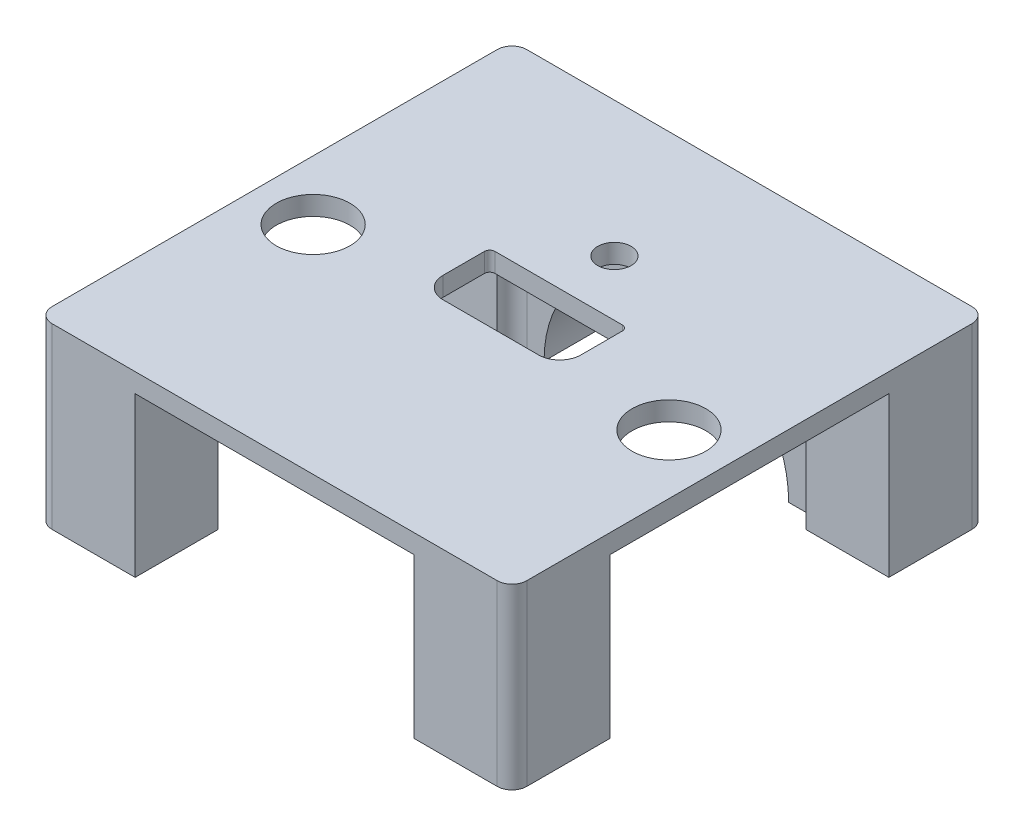
ISO-10303-21;
HEADER;
FILE_DESCRIPTION(('STEP AP214'),'2;1');
FILE_NAME('part.step','',(''),(''),'','','');
FILE_SCHEMA(('AUTOMOTIVE_DESIGN { 1 0 10303 214 1 1 1 1 }'));
ENDSEC;
DATA;
#1=APPLICATION_CONTEXT('core data for automotive mechanical design processes');
#2=APPLICATION_PROTOCOL_DEFINITION('international standard','automotive_design',2000,#1);
#3=PRODUCT_CONTEXT('',#1,'mechanical');
#4=PRODUCT('Part','Part','',(#3));
#5=PRODUCT_RELATED_PRODUCT_CATEGORY('part','',(#4));
#6=PRODUCT_DEFINITION_FORMATION('','',#4);
#7=PRODUCT_DEFINITION_CONTEXT('part definition',#1,'design');
#8=PRODUCT_DEFINITION('design','',#6,#7);
#9=PRODUCT_DEFINITION_SHAPE('','',#8);
#10=(LENGTH_UNIT() NAMED_UNIT(*) SI_UNIT(.MILLI.,.METRE.));
#11=(NAMED_UNIT(*) PLANE_ANGLE_UNIT() SI_UNIT($,.RADIAN.));
#12=(NAMED_UNIT(*) SI_UNIT($,.STERADIAN.) SOLID_ANGLE_UNIT());
#13=UNCERTAINTY_MEASURE_WITH_UNIT(LENGTH_MEASURE(1.E-05),#10,'distance_accuracy_value','');
#14=(GEOMETRIC_REPRESENTATION_CONTEXT(3) GLOBAL_UNCERTAINTY_ASSIGNED_CONTEXT((#13)) GLOBAL_UNIT_ASSIGNED_CONTEXT((#10,
#11,#12)) REPRESENTATION_CONTEXT('',''));
#15=CARTESIAN_POINT('',(0.,0.,0.));
#16=DIRECTION('',(0.,0.,1.));
#17=DIRECTION('',(1.,0.,0.));
#18=AXIS2_PLACEMENT_3D('',#15,#16,#17);
#19=CARTESIAN_POINT('',(20.975,-15.,-20.975));
#20=DIRECTION('',(0.,-1.,0.));
#21=DIRECTION('',(0.,0.,-1.));
#22=AXIS2_PLACEMENT_3D('',#19,#20,#21);
#23=PLANE('',#22);
#24=DIRECTION('',(0.,0.,-1.));
#25=VECTOR('',#24,1.);
#26=CARTESIAN_POINT('',(-11.530245674906,-15.,22.376));
#27=LINE('',#26,#25);
#28=CARTESIAN_POINT('',(-11.530245674906,-15.,-22.375));
#29=VERTEX_POINT('',#28);
#30=CARTESIAN_POINT('',(-11.530245674906,-15.,-14.55));
#31=VERTEX_POINT('',#30);
#32=EDGE_CURVE('E259',#29,#31,#27,.F.);
#33=ORIENTED_EDGE('',*,*,#32,.T.);
#34=DIRECTION('',(-1.,0.,0.));
#35=VECTOR('',#34,1.);
#36=CARTESIAN_POINT('',(-13.15,-15.,-14.55));
#37=LINE('',#36,#35);
#38=CARTESIAN_POINT('',(-13.15,-15.,-14.55));
#39=VERTEX_POINT('',#38);
#40=EDGE_CURVE('E269',#31,#39,#37,.T.);
#41=ORIENTED_EDGE('',*,*,#40,.T.);
#42=CARTESIAN_POINT('',(-13.15,-15.,-13.15));
#43=DIRECTION('',(0.,1.,0.));
#44=DIRECTION('',(0.,0.,1.));
#45=AXIS2_PLACEMENT_3D('',#42,#43,#44);
#46=CIRCLE('',#45,1.4);
#47=CARTESIAN_POINT('',(-14.55,-15.,-13.15));
#48=VERTEX_POINT('',#47);
#49=EDGE_CURVE('E278',#39,#48,#46,.T.);
#50=ORIENTED_EDGE('',*,*,#49,.T.);
#51=DIRECTION('',(-1.,0.,0.));
#52=VECTOR('',#51,1.);
#53=CARTESIAN_POINT('',(-14.55,-15.,-13.15));
#54=LINE('',#53,#52);
#55=CARTESIAN_POINT('',(-22.375,-15.,-13.15));
#56=VERTEX_POINT('',#55);
#57=EDGE_CURVE('E282',#48,#56,#54,.T.);
#58=ORIENTED_EDGE('',*,*,#57,.T.);
#59=DIRECTION('',(0.,0.,-1.));
#60=VECTOR('',#59,1.);
#61=CARTESIAN_POINT('',(-22.375,-15.,-20.975));
#62=LINE('',#61,#60);
#63=CARTESIAN_POINT('',(-22.375,-15.,-20.975));
#64=VERTEX_POINT('',#63);
#65=EDGE_CURVE('E289',#56,#64,#62,.T.);
#66=ORIENTED_EDGE('',*,*,#65,.T.);
#67=CARTESIAN_POINT('',(-20.975,-15.,-20.975));
#68=DIRECTION('',(0.,-1.,0.));
#69=DIRECTION('',(0.,0.,1.));
#70=AXIS2_PLACEMENT_3D('',#67,#68,#69);
#71=CIRCLE('',#70,1.4);
#72=CARTESIAN_POINT('',(-20.975,-15.,-22.375));
#73=VERTEX_POINT('',#72);
#74=EDGE_CURVE('E293',#64,#73,#71,.T.);
#75=ORIENTED_EDGE('',*,*,#74,.T.);
#76=DIRECTION('',(1.,0.,0.));
#77=VECTOR('',#76,1.);
#78=CARTESIAN_POINT('',(-20.975,-15.,-22.375));
#79=LINE('',#78,#77);
#80=EDGE_CURVE('E298',#73,#29,#79,.T.);
#81=ORIENTED_EDGE('',*,*,#80,.T.);
#82=EDGE_LOOP('',(#33,#41,#50,#58,#66,#75,#81));
#83=FACE_BOUND('',#82,.T.);
#84=ADVANCED_FACE('F43',(#83),#23,.T.);
#85=CARTESIAN_POINT('',(-20.975,0.,20.975));
#86=DIRECTION('',(0.,1.,0.));
#87=DIRECTION('',(0.,0.,1.));
#88=AXIS2_PLACEMENT_3D('',#85,#86,#87);
#89=PLANE('',#88);
#90=CARTESIAN_POINT('',(-16.77,0.,1.975));
#91=DIRECTION('',(0.,1.,0.));
#92=DIRECTION('',(0.,0.,1.));
#93=AXIS2_PLACEMENT_3D('',#90,#91,#92);
#94=CIRCLE('',#93,3.475);
#95=CARTESIAN_POINT('',(-16.77,0.,5.45));
#96=VERTEX_POINT('',#95);
#97=EDGE_CURVE('E260',#96,#96,#94,.T.);
#98=ORIENTED_EDGE('',*,*,#97,.T.);
#99=EDGE_LOOP('',(#98));
#100=FACE_BOUND('',#99,.T.);
#101=CARTESIAN_POINT('',(16.77,0.,1.97499999999999));
#102=DIRECTION('',(0.,1.,0.));
#103=DIRECTION('',(0.,0.,1.));
#104=AXIS2_PLACEMENT_3D('',#101,#102,#103);
#105=CIRCLE('',#104,3.475);
#106=CARTESIAN_POINT('',(16.77,0.,5.44999999999999));
#107=VERTEX_POINT('',#106);
#108=EDGE_CURVE('E739',#107,#107,#105,.T.);
#109=ORIENTED_EDGE('',*,*,#108,.T.);
#110=EDGE_LOOP('',(#109));
#111=FACE_BOUND('',#110,.T.);
#112=CARTESIAN_POINT('',(0.,0.,-9.65499999999999));
#113=DIRECTION('',(0.,1.,0.));
#114=DIRECTION('',(0.,0.,1.));
#115=AXIS2_PLACEMENT_3D('',#112,#113,#114);
#116=CIRCLE('',#115,1.575);
#117=CARTESIAN_POINT('',(0.,0.,-8.07999999999999));
#118=VERTEX_POINT('',#117);
#119=EDGE_CURVE('E347',#118,#118,#116,.T.);
#120=ORIENTED_EDGE('',*,*,#119,.T.);
#121=EDGE_LOOP('',(#120));
#122=FACE_BOUND('',#121,.T.);
#123=CARTESIAN_POINT('',(-4.5,0.,0.));
#124=DIRECTION('',(0.,1.,0.));
#125=DIRECTION('',(0.,0.,1.));
#126=AXIS2_PLACEMENT_3D('',#123,#124,#125);
#127=CIRCLE('',#126,2.);
#128=CARTESIAN_POINT('',(-6.5,0.,0.));
#129=VERTEX_POINT('',#128);
#130=CARTESIAN_POINT('',(-4.5,0.,2.));
#131=VERTEX_POINT('',#130);
#132=EDGE_CURVE('E352',#129,#131,#127,.T.);
#133=ORIENTED_EDGE('',*,*,#132,.T.);
#134=DIRECTION('',(1.,0.,0.));
#135=VECTOR('',#134,1.);
#136=CARTESIAN_POINT('',(-4.5,0.,2.));
#137=LINE('',#136,#135);
#138=CARTESIAN_POINT('',(4.5,0.,2.));
#139=VERTEX_POINT('',#138);
#140=EDGE_CURVE('E386',#131,#139,#137,.T.);
#141=ORIENTED_EDGE('',*,*,#140,.T.);
#142=CARTESIAN_POINT('',(4.5,0.,0.));
#143=DIRECTION('',(0.,1.,0.));
#144=DIRECTION('',(0.,0.,-1.));
#145=AXIS2_PLACEMENT_3D('',#142,#143,#144);
#146=CIRCLE('',#145,2.);
#147=CARTESIAN_POINT('',(6.5,0.,0.));
#148=VERTEX_POINT('',#147);
#149=EDGE_CURVE('E390',#139,#148,#146,.T.);
#150=ORIENTED_EDGE('',*,*,#149,.T.);
#151=DIRECTION('',(0.,0.,-1.));
#152=VECTOR('',#151,1.);
#153=CARTESIAN_POINT('',(6.5,0.,0.));
#154=LINE('',#153,#152);
#155=CARTESIAN_POINT('',(6.5,0.,-3.9));
#156=VERTEX_POINT('',#155);
#157=EDGE_CURVE('E394',#148,#156,#154,.T.);
#158=ORIENTED_EDGE('',*,*,#157,.T.);
#159=CARTESIAN_POINT('',(6.,0.,-3.9));
#160=DIRECTION('',(0.,1.,0.));
#161=DIRECTION('',(0.,0.,1.));
#162=AXIS2_PLACEMENT_3D('',#159,#160,#161);
#163=CIRCLE('',#162,0.499999999999999);
#164=CARTESIAN_POINT('',(6.,0.,-4.4));
#165=VERTEX_POINT('',#164);
#166=EDGE_CURVE('E398',#156,#165,#163,.T.);
#167=ORIENTED_EDGE('',*,*,#166,.T.);
#168=DIRECTION('',(-1.,0.,0.));
#169=VECTOR('',#168,1.);
#170=CARTESIAN_POINT('',(-6.,0.,-4.4));
#171=LINE('',#170,#169);
#172=CARTESIAN_POINT('',(-6.,0.,-4.4));
#173=VERTEX_POINT('',#172);
#174=EDGE_CURVE('E402',#165,#173,#171,.T.);
#175=ORIENTED_EDGE('',*,*,#174,.T.);
#176=CARTESIAN_POINT('',(-6.,0.,-3.9));
#177=DIRECTION('',(0.,1.,0.));
#178=DIRECTION('',(0.,0.,-1.));
#179=AXIS2_PLACEMENT_3D('',#176,#177,#178);
#180=CIRCLE('',#179,0.499999999999999);
#181=CARTESIAN_POINT('',(-6.5,0.,-3.9));
#182=VERTEX_POINT('',#181);
#183=EDGE_CURVE('E406',#173,#182,#180,.T.);
#184=ORIENTED_EDGE('',*,*,#183,.T.);
#185=DIRECTION('',(0.,0.,1.));
#186=VECTOR('',#185,1.);
#187=CARTESIAN_POINT('',(-6.5,0.,0.));
#188=LINE('',#187,#186);
#189=EDGE_CURVE('E360',#182,#129,#188,.T.);
#190=ORIENTED_EDGE('',*,*,#189,.T.);
#191=EDGE_LOOP('',(#133,#141,#150,#158,#167,#175,#184,#190));
#192=FACE_BOUND('',#191,.T.);
#193=DIRECTION('',(1.,0.,0.));
#194=VECTOR('',#193,1.);
#195=CARTESIAN_POINT('',(-14.55,0.,13.15));
#196=LINE('',#195,#194);
#197=CARTESIAN_POINT('',(-22.375,0.,13.15));
#198=VERTEX_POINT('',#197);
#199=CARTESIAN_POINT('',(-14.55,0.,13.15));
#200=VERTEX_POINT('',#199);
#201=EDGE_CURVE('E577',#198,#200,#196,.T.);
#202=ORIENTED_EDGE('',*,*,#201,.F.);
#203=DIRECTION('',(0.,0.,1.));
#204=VECTOR('',#203,1.);
#205=CARTESIAN_POINT('',(-22.375,0.,20.975));
#206=LINE('',#205,#204);
#207=CARTESIAN_POINT('',(-22.375,0.,-13.15));
#208=VERTEX_POINT('',#207);
#209=EDGE_CURVE('E444',#208,#198,#206,.T.);
#210=ORIENTED_EDGE('',*,*,#209,.F.);
#211=DIRECTION('',(-1.,0.,0.));
#212=VECTOR('',#211,1.);
#213=CARTESIAN_POINT('',(-14.55,0.,-13.15));
#214=LINE('',#213,#212);
#215=CARTESIAN_POINT('',(-14.55,0.,-13.15));
#216=VERTEX_POINT('',#215);
#217=EDGE_CURVE('E320',#216,#208,#214,.T.);
#218=ORIENTED_EDGE('',*,*,#217,.F.);
#219=CARTESIAN_POINT('',(-13.15,0.,-13.15));
#220=DIRECTION('',(0.,1.,0.));
#221=DIRECTION('',(0.,0.,1.));
#222=AXIS2_PLACEMENT_3D('',#219,#220,#221);
#223=CIRCLE('',#222,1.4);
#224=CARTESIAN_POINT('',(-13.15,0.,-14.55));
#225=VERTEX_POINT('',#224);
#226=EDGE_CURVE('E316',#225,#216,#223,.T.);
#227=ORIENTED_EDGE('',*,*,#226,.F.);
#228=DIRECTION('',(-1.,0.,0.));
#229=VECTOR('',#228,1.);
#230=CARTESIAN_POINT('',(-13.15,0.,-14.55));
#231=LINE('',#230,#229);
#232=CARTESIAN_POINT('',(13.15,0.,-14.55));
#233=VERTEX_POINT('',#232);
#234=EDGE_CURVE('E312',#233,#225,#231,.T.);
#235=ORIENTED_EDGE('',*,*,#234,.F.);
#236=CARTESIAN_POINT('',(13.15,0.,-13.15));
#237=DIRECTION('',(0.,1.,0.));
#238=DIRECTION('',(0.,0.,-1.));
#239=AXIS2_PLACEMENT_3D('',#236,#237,#238);
#240=CIRCLE('',#239,1.4);
#241=CARTESIAN_POINT('',(14.55,0.,-13.15));
#242=VERTEX_POINT('',#241);
#243=EDGE_CURVE('E307',#242,#233,#240,.T.);
#244=ORIENTED_EDGE('',*,*,#243,.F.);
#245=DIRECTION('',(-1.,0.,0.));
#246=VECTOR('',#245,1.);
#247=CARTESIAN_POINT('',(14.55,0.,-13.15));
#248=LINE('',#247,#246);
#249=CARTESIAN_POINT('',(22.375,0.,-13.15));
#250=VERTEX_POINT('',#249);
#251=EDGE_CURVE('E303',#250,#242,#248,.T.);
#252=ORIENTED_EDGE('',*,*,#251,.F.);
#253=DIRECTION('',(0.,0.,-1.));
#254=VECTOR('',#253,1.);
#255=CARTESIAN_POINT('',(22.375,0.,20.975));
#256=LINE('',#255,#254);
#257=CARTESIAN_POINT('',(22.375,0.,13.15));
#258=VERTEX_POINT('',#257);
#259=EDGE_CURVE('E468',#258,#250,#256,.T.);
#260=ORIENTED_EDGE('',*,*,#259,.F.);
#261=DIRECTION('',(1.,0.,0.));
#262=VECTOR('',#261,1.);
#263=CARTESIAN_POINT('',(14.55,0.,13.15));
#264=LINE('',#263,#262);
#265=CARTESIAN_POINT('',(14.55,0.,13.15));
#266=VERTEX_POINT('',#265);
#267=EDGE_CURVE('E516',#266,#258,#264,.T.);
#268=ORIENTED_EDGE('',*,*,#267,.F.);
#269=CARTESIAN_POINT('',(13.15,0.,13.15));
#270=DIRECTION('',(0.,1.,0.));
#271=DIRECTION('',(0.,0.,-1.));
#272=AXIS2_PLACEMENT_3D('',#269,#270,#271);
#273=CIRCLE('',#272,1.4);
#274=CARTESIAN_POINT('',(13.15,0.,14.55));
#275=VERTEX_POINT('',#274);
#276=EDGE_CURVE('E519',#275,#266,#273,.T.);
#277=ORIENTED_EDGE('',*,*,#276,.F.);
#278=DIRECTION('',(0.,0.,-1.));
#279=VECTOR('',#278,1.);
#280=CARTESIAN_POINT('',(13.15,0.,14.55));
#281=LINE('',#280,#279);
#282=CARTESIAN_POINT('',(13.15,0.,22.375));
#283=VERTEX_POINT('',#282);
#284=EDGE_CURVE('E308',#283,#275,#281,.T.);
#285=ORIENTED_EDGE('',*,*,#284,.F.);
#286=DIRECTION('',(1.,0.,0.));
#287=VECTOR('',#286,1.);
#288=CARTESIAN_POINT('',(-20.975,0.,22.375));
#289=LINE('',#288,#287);
#290=CARTESIAN_POINT('',(-13.15,0.,22.375));
#291=VERTEX_POINT('',#290);
#292=EDGE_CURVE('E438',#291,#283,#289,.T.);
#293=ORIENTED_EDGE('',*,*,#292,.F.);
#294=DIRECTION('',(0.,0.,1.));
#295=VECTOR('',#294,1.);
#296=CARTESIAN_POINT('',(-13.15,0.,14.55));
#297=LINE('',#296,#295);
#298=CARTESIAN_POINT('',(-13.15,0.,14.55));
#299=VERTEX_POINT('',#298);
#300=EDGE_CURVE('E570',#299,#291,#297,.T.);
#301=ORIENTED_EDGE('',*,*,#300,.F.);
#302=CARTESIAN_POINT('',(-13.15,0.,13.15));
#303=DIRECTION('',(0.,1.,0.));
#304=DIRECTION('',(0.,0.,-1.));
#305=AXIS2_PLACEMENT_3D('',#302,#303,#304);
#306=CIRCLE('',#305,1.4);
#307=EDGE_CURVE('E573',#200,#299,#306,.T.);
#308=ORIENTED_EDGE('',*,*,#307,.F.);
#309=EDGE_LOOP('',(#202,#210,#218,#227,#235,#244,#252,#260,#268,#277,#285,#293,#301,#308));
#310=FACE_BOUND('',#309,.T.);
#311=ADVANCED_FACE('F673',(#100,#111,#122,#192,#310),#89,.F.);
#312=CARTESIAN_POINT('',(-20.975,1.8,20.975));
#313=DIRECTION('',(0.,1.,0.));
#314=DIRECTION('',(0.,0.,1.));
#315=AXIS2_PLACEMENT_3D('',#312,#313,#314);
#316=PLANE('',#315);
#317=CARTESIAN_POINT('',(-16.77,1.8,1.975));
#318=DIRECTION('',(0.,1.,0.));
#319=DIRECTION('',(0.,0.,1.));
#320=AXIS2_PLACEMENT_3D('',#317,#318,#319);
#321=CIRCLE('',#320,3.475);
#322=CARTESIAN_POINT('',(-16.77,1.8,5.45));
#323=VERTEX_POINT('',#322);
#324=EDGE_CURVE('E735',#323,#323,#321,.T.);
#325=ORIENTED_EDGE('',*,*,#324,.F.);
#326=EDGE_LOOP('',(#325));
#327=FACE_BOUND('',#326,.T.);
#328=CARTESIAN_POINT('',(16.77,1.8,1.97499999999999));
#329=DIRECTION('',(0.,1.,0.));
#330=DIRECTION('',(0.,0.,1.));
#331=AXIS2_PLACEMENT_3D('',#328,#329,#330);
#332=CIRCLE('',#331,3.475);
#333=CARTESIAN_POINT('',(16.77,1.8,5.44999999999999));
#334=VERTEX_POINT('',#333);
#335=EDGE_CURVE('E744',#334,#334,#332,.T.);
#336=ORIENTED_EDGE('',*,*,#335,.F.);
#337=EDGE_LOOP('',(#336));
#338=FACE_BOUND('',#337,.T.);
#339=DIRECTION('',(1.,0.,0.));
#340=VECTOR('',#339,1.);
#341=CARTESIAN_POINT('',(-4.5,1.8,2.));
#342=LINE('',#341,#340);
#343=CARTESIAN_POINT('',(-4.5,1.8,2.));
#344=VERTEX_POINT('',#343);
#345=CARTESIAN_POINT('',(4.5,1.8,2.));
#346=VERTEX_POINT('',#345);
#347=EDGE_CURVE('E359',#344,#346,#342,.T.);
#348=ORIENTED_EDGE('',*,*,#347,.F.);
#349=CARTESIAN_POINT('',(-4.5,1.8,0.));
#350=DIRECTION('',(0.,1.,0.));
#351=DIRECTION('',(0.,0.,1.));
#352=AXIS2_PLACEMENT_3D('',#349,#350,#351);
#353=CIRCLE('',#352,2.);
#354=CARTESIAN_POINT('',(-6.5,1.8,0.));
#355=VERTEX_POINT('',#354);
#356=EDGE_CURVE('E356',#355,#344,#353,.T.);
#357=ORIENTED_EDGE('',*,*,#356,.F.);
#358=DIRECTION('',(0.,0.,1.));
#359=VECTOR('',#358,1.);
#360=CARTESIAN_POINT('',(-6.5,1.8,0.));
#361=LINE('',#360,#359);
#362=CARTESIAN_POINT('',(-6.5,1.8,-3.9));
#363=VERTEX_POINT('',#362);
#364=EDGE_CURVE('E379',#363,#355,#361,.T.);
#365=ORIENTED_EDGE('',*,*,#364,.F.);
#366=CARTESIAN_POINT('',(-6.,1.8,-3.9));
#367=DIRECTION('',(0.,1.,0.));
#368=DIRECTION('',(0.,0.,-1.));
#369=AXIS2_PLACEMENT_3D('',#366,#367,#368);
#370=CIRCLE('',#369,0.499999999999999);
#371=CARTESIAN_POINT('',(-6.,1.8,-4.4));
#372=VERTEX_POINT('',#371);
#373=EDGE_CURVE('E375',#372,#363,#370,.T.);
#374=ORIENTED_EDGE('',*,*,#373,.F.);
#375=DIRECTION('',(-1.,0.,0.));
#376=VECTOR('',#375,1.);
#377=CARTESIAN_POINT('',(-6.,1.8,-4.4));
#378=LINE('',#377,#376);
#379=CARTESIAN_POINT('',(6.,1.8,-4.4));
#380=VERTEX_POINT('',#379);
#381=EDGE_CURVE('E372',#380,#372,#378,.T.);
#382=ORIENTED_EDGE('',*,*,#381,.F.);
#383=CARTESIAN_POINT('',(6.,1.8,-3.9));
#384=DIRECTION('',(0.,1.,0.));
#385=DIRECTION('',(0.,0.,1.));
#386=AXIS2_PLACEMENT_3D('',#383,#384,#385);
#387=CIRCLE('',#386,0.499999999999999);
#388=CARTESIAN_POINT('',(6.5,1.8,-3.9));
#389=VERTEX_POINT('',#388);
#390=EDGE_CURVE('E369',#389,#380,#387,.T.);
#391=ORIENTED_EDGE('',*,*,#390,.F.);
#392=DIRECTION('',(0.,0.,-1.));
#393=VECTOR('',#392,1.);
#394=CARTESIAN_POINT('',(6.5,1.8,0.));
#395=LINE('',#394,#393);
#396=CARTESIAN_POINT('',(6.5,1.8,0.));
#397=VERTEX_POINT('',#396);
#398=EDGE_CURVE('E366',#397,#389,#395,.T.);
#399=ORIENTED_EDGE('',*,*,#398,.F.);
#400=CARTESIAN_POINT('',(4.5,1.8,0.));
#401=DIRECTION('',(0.,1.,0.));
#402=DIRECTION('',(0.,0.,-1.));
#403=AXIS2_PLACEMENT_3D('',#400,#401,#402);
#404=CIRCLE('',#403,2.);
#405=EDGE_CURVE('E363',#346,#397,#404,.T.);
#406=ORIENTED_EDGE('',*,*,#405,.F.);
#407=EDGE_LOOP('',(#348,#357,#365,#374,#382,#391,#399,#406));
#408=FACE_BOUND('',#407,.T.);
#409=CARTESIAN_POINT('',(-20.975,1.8,20.975));
#410=DIRECTION('',(0.,1.,0.));
#411=DIRECTION('',(0.,0.,1.));
#412=AXIS2_PLACEMENT_3D('',#409,#410,#411);
#413=CIRCLE('',#412,1.4);
#414=CARTESIAN_POINT('',(-22.375,1.8,20.975));
#415=VERTEX_POINT('',#414);
#416=CARTESIAN_POINT('',(-20.975,1.8,22.375));
#417=VERTEX_POINT('',#416);
#418=EDGE_CURVE('E439',#415,#417,#413,.T.);
#419=ORIENTED_EDGE('',*,*,#418,.T.);
#420=DIRECTION('',(1.,0.,0.));
#421=VECTOR('',#420,1.);
#422=CARTESIAN_POINT('',(-20.975,1.8,22.375));
#423=LINE('',#422,#421);
#424=CARTESIAN_POINT('',(20.975,1.8,22.375));
#425=VERTEX_POINT('',#424);
#426=EDGE_CURVE('E443',#417,#425,#423,.T.);
#427=ORIENTED_EDGE('',*,*,#426,.T.);
#428=CARTESIAN_POINT('',(20.975,1.8,20.975));
#429=DIRECTION('',(0.,1.,0.));
#430=DIRECTION('',(0.,0.,1.));
#431=AXIS2_PLACEMENT_3D('',#428,#429,#430);
#432=CIRCLE('',#431,1.4);
#433=CARTESIAN_POINT('',(22.375,1.8,20.975));
#434=VERTEX_POINT('',#433);
#435=EDGE_CURVE('E447',#425,#434,#432,.T.);
#436=ORIENTED_EDGE('',*,*,#435,.T.);
#437=DIRECTION('',(0.,0.,-1.));
#438=VECTOR('',#437,1.);
#439=CARTESIAN_POINT('',(22.375,1.8,20.975));
#440=LINE('',#439,#438);
#441=CARTESIAN_POINT('',(22.375,1.8,-20.975));
#442=VERTEX_POINT('',#441);
#443=EDGE_CURVE('E450',#434,#442,#440,.T.);
#444=ORIENTED_EDGE('',*,*,#443,.T.);
#445=CARTESIAN_POINT('',(20.975,1.8,-20.975));
#446=DIRECTION('',(0.,1.,0.));
#447=DIRECTION('',(0.,0.,1.));
#448=AXIS2_PLACEMENT_3D('',#445,#446,#447);
#449=CIRCLE('',#448,1.4);
#450=CARTESIAN_POINT('',(20.975,1.8,-22.375));
#451=VERTEX_POINT('',#450);
#452=EDGE_CURVE('E453',#442,#451,#449,.T.);
#453=ORIENTED_EDGE('',*,*,#452,.T.);
#454=DIRECTION('',(-1.,0.,0.));
#455=VECTOR('',#454,1.);
#456=CARTESIAN_POINT('',(-20.975,1.8,-22.375));
#457=LINE('',#456,#455);
#458=CARTESIAN_POINT('',(-20.975,1.8,-22.375));
#459=VERTEX_POINT('',#458);
#460=EDGE_CURVE('E456',#451,#459,#457,.T.);
#461=ORIENTED_EDGE('',*,*,#460,.T.);
#462=CARTESIAN_POINT('',(-20.975,1.8,-20.975));
#463=DIRECTION('',(0.,1.,0.));
#464=DIRECTION('',(0.,0.,-1.));
#465=AXIS2_PLACEMENT_3D('',#462,#463,#464);
#466=CIRCLE('',#465,1.4);
#467=CARTESIAN_POINT('',(-22.375,1.8,-20.975));
#468=VERTEX_POINT('',#467);
#469=EDGE_CURVE('E459',#459,#468,#466,.T.);
#470=ORIENTED_EDGE('',*,*,#469,.T.);
#471=DIRECTION('',(0.,0.,1.));
#472=VECTOR('',#471,1.);
#473=CARTESIAN_POINT('',(-22.375,1.8,20.975));
#474=LINE('',#473,#472);
#475=EDGE_CURVE('E462',#468,#415,#474,.T.);
#476=ORIENTED_EDGE('',*,*,#475,.T.);
#477=EDGE_LOOP('',(#419,#427,#436,#444,#453,#461,#470,#476));
#478=FACE_BOUND('',#477,.T.);
#479=CARTESIAN_POINT('',(0.,1.8,-9.65499999999999));
#480=DIRECTION('',(0.,1.,0.));
#481=DIRECTION('',(0.,0.,1.));
#482=AXIS2_PLACEMENT_3D('',#479,#480,#481);
#483=CIRCLE('',#482,1.575);
#484=CARTESIAN_POINT('',(0.,1.8,-8.07999999999999));
#485=VERTEX_POINT('',#484);
#486=EDGE_CURVE('E348',#485,#485,#483,.T.);
#487=ORIENTED_EDGE('',*,*,#486,.F.);
#488=EDGE_LOOP('',(#487));
#489=FACE_BOUND('',#488,.T.);
#490=ADVANCED_FACE('F641',(#327,#338,#408,#478,#489),#316,.T.);
#491=CARTESIAN_POINT('',(-20.975,1.8,20.975));
#492=DIRECTION('',(0.,-1.,0.));
#493=DIRECTION('',(0.,0.,-1.));
#494=AXIS2_PLACEMENT_3D('',#491,#492,#493);
#495=CYLINDRICAL_SURFACE('',#494,1.4);
#496=DIRECTION('',(0.,-1.,0.));
#497=VECTOR('',#496,1.);
#498=CARTESIAN_POINT('',(-22.375,1.8,20.975));
#499=LINE('',#498,#497);
#500=CARTESIAN_POINT('',(-22.375,-15.,20.975));
#501=VERTEX_POINT('',#500);
#502=EDGE_CURVE('E465',#415,#501,#499,.T.);
#503=ORIENTED_EDGE('',*,*,#502,.T.);
#504=CARTESIAN_POINT('',(-20.975,-15.,20.975));
#505=DIRECTION('',(0.,-1.,0.));
#506=DIRECTION('',(0.,0.,1.));
#507=AXIS2_PLACEMENT_3D('',#504,#505,#506);
#508=CIRCLE('',#507,1.4);
#509=CARTESIAN_POINT('',(-20.975,-15.,22.375));
#510=VERTEX_POINT('',#509);
#511=EDGE_CURVE('E574',#510,#501,#508,.T.);
#512=ORIENTED_EDGE('',*,*,#511,.F.);
#513=DIRECTION('',(0.,-1.,0.));
#514=VECTOR('',#513,1.);
#515=CARTESIAN_POINT('',(-20.975,1.8,22.375));
#516=LINE('',#515,#514);
#517=EDGE_CURVE('E11',#417,#510,#516,.T.);
#518=ORIENTED_EDGE('',*,*,#517,.F.);
#519=ORIENTED_EDGE('',*,*,#418,.F.);
#520=EDGE_LOOP('',(#503,#512,#518,#519));
#521=FACE_BOUND('',#520,.T.);
#522=ADVANCED_FACE('F45',(#521),#495,.T.);
#523=CARTESIAN_POINT('',(-20.975,1.8,22.375));
#524=DIRECTION('',(0.,0.,-1.));
#525=DIRECTION('',(-1.,0.,0.));
#526=AXIS2_PLACEMENT_3D('',#523,#524,#525);
#527=PLANE('',#526);
#528=ORIENTED_EDGE('',*,*,#517,.T.);
#529=DIRECTION('',(-1.,0.,0.));
#530=VECTOR('',#529,1.);
#531=CARTESIAN_POINT('',(-20.975,-15.,22.375));
#532=LINE('',#531,#530);
#533=CARTESIAN_POINT('',(-13.15,-15.,22.375));
#534=VERTEX_POINT('',#533);
#535=EDGE_CURVE('E569',#534,#510,#532,.T.);
#536=ORIENTED_EDGE('',*,*,#535,.F.);
#537=DIRECTION('',(0.,1.,0.));
#538=VECTOR('',#537,1.);
#539=CARTESIAN_POINT('',(-13.15,-15.,22.375));
#540=LINE('',#539,#538);
#541=EDGE_CURVE('E565',#534,#291,#540,.T.);
#542=ORIENTED_EDGE('',*,*,#541,.T.);
#543=ORIENTED_EDGE('',*,*,#292,.T.);
#544=DIRECTION('',(0.,1.,0.));
#545=VECTOR('',#544,1.);
#546=CARTESIAN_POINT('',(13.15,-15.,22.375));
#547=LINE('',#546,#545);
#548=CARTESIAN_POINT('',(13.15,-15.,22.375));
#549=VERTEX_POINT('',#548);
#550=EDGE_CURVE('E506',#549,#283,#547,.T.);
#551=ORIENTED_EDGE('',*,*,#550,.F.);
#552=DIRECTION('',(-1.,0.,0.));
#553=VECTOR('',#552,1.);
#554=CARTESIAN_POINT('',(13.15,-15.,22.375));
#555=LINE('',#554,#553);
#556=CARTESIAN_POINT('',(20.975,-15.,22.375));
#557=VERTEX_POINT('',#556);
#558=EDGE_CURVE('E503',#557,#549,#555,.T.);
#559=ORIENTED_EDGE('',*,*,#558,.F.);
#560=DIRECTION('',(0.,-1.,0.));
#561=VECTOR('',#560,1.);
#562=CARTESIAN_POINT('',(20.975,1.8,22.375));
#563=LINE('',#562,#561);
#564=EDGE_CURVE('E52',#425,#557,#563,.T.);
#565=ORIENTED_EDGE('',*,*,#564,.F.);
#566=ORIENTED_EDGE('',*,*,#426,.F.);
#567=EDGE_LOOP('',(#528,#536,#542,#543,#551,#559,#565,#566));
#568=FACE_BOUND('',#567,.T.);
#569=ADVANCED_FACE('F504',(#568),#527,.F.);
#570=CARTESIAN_POINT('',(20.975,1.8,20.975));
#571=DIRECTION('',(0.,-1.,0.));
#572=DIRECTION('',(0.,0.,-1.));
#573=AXIS2_PLACEMENT_3D('',#570,#571,#572);
#574=CYLINDRICAL_SURFACE('',#573,1.4);
#575=ORIENTED_EDGE('',*,*,#564,.T.);
#576=CARTESIAN_POINT('',(20.975,-15.,20.975));
#577=DIRECTION('',(0.,-1.,0.));
#578=DIRECTION('',(0.,0.,-1.));
#579=AXIS2_PLACEMENT_3D('',#576,#577,#578);
#580=CIRCLE('',#579,1.4);
#581=CARTESIAN_POINT('',(22.375,-15.,20.975));
#582=VERTEX_POINT('',#581);
#583=EDGE_CURVE('E500',#582,#557,#580,.T.);
#584=ORIENTED_EDGE('',*,*,#583,.F.);
#585=DIRECTION('',(0.,-1.,0.));
#586=VECTOR('',#585,1.);
#587=CARTESIAN_POINT('',(22.375,1.8,20.975));
#588=LINE('',#587,#586);
#589=EDGE_CURVE('E489',#434,#582,#588,.T.);
#590=ORIENTED_EDGE('',*,*,#589,.F.);
#591=ORIENTED_EDGE('',*,*,#435,.F.);
#592=EDGE_LOOP('',(#575,#584,#590,#591));
#593=FACE_BOUND('',#592,.T.);
#594=ADVANCED_FACE('F497',(#593),#574,.T.);
#595=CARTESIAN_POINT('',(22.375,1.8,20.975));
#596=DIRECTION('',(-1.,0.,0.));
#597=DIRECTION('',(0.,0.,1.));
#598=AXIS2_PLACEMENT_3D('',#595,#596,#597);
#599=PLANE('',#598);
#600=ORIENTED_EDGE('',*,*,#589,.T.);
#601=DIRECTION('',(0.,0.,1.));
#602=VECTOR('',#601,1.);
#603=CARTESIAN_POINT('',(22.375,-15.,13.15));
#604=LINE('',#603,#602);
#605=CARTESIAN_POINT('',(22.375,-15.,13.15));
#606=VERTEX_POINT('',#605);
#607=EDGE_CURVE('E514',#606,#582,#604,.T.);
#608=ORIENTED_EDGE('',*,*,#607,.F.);
#609=DIRECTION('',(0.,1.,0.));
#610=VECTOR('',#609,1.);
#611=CARTESIAN_POINT('',(22.375,-15.,13.15));
#612=LINE('',#611,#610);
#613=EDGE_CURVE('E67',#606,#258,#612,.T.);
#614=ORIENTED_EDGE('',*,*,#613,.T.);
#615=ORIENTED_EDGE('',*,*,#259,.T.);
#616=DIRECTION('',(0.,1.,0.));
#617=VECTOR('',#616,1.);
#618=CARTESIAN_POINT('',(22.375,-15.,-13.15));
#619=LINE('',#618,#617);
#620=CARTESIAN_POINT('',(22.375,-15.,-13.15));
#621=VERTEX_POINT('',#620);
#622=EDGE_CURVE('E343',#621,#250,#619,.T.);
#623=ORIENTED_EDGE('',*,*,#622,.F.);
#624=DIRECTION('',(0.,0.,1.));
#625=VECTOR('',#624,1.);
#626=CARTESIAN_POINT('',(22.375,-15.,-20.975));
#627=LINE('',#626,#625);
#628=CARTESIAN_POINT('',(22.375,-15.,-20.975));
#629=VERTEX_POINT('',#628);
#630=EDGE_CURVE('E526',#629,#621,#627,.T.);
#631=ORIENTED_EDGE('',*,*,#630,.F.);
#632=DIRECTION('',(0.,-1.,0.));
#633=VECTOR('',#632,1.);
#634=CARTESIAN_POINT('',(22.375,1.8,-20.975));
#635=LINE('',#634,#633);
#636=EDGE_CURVE('E486',#442,#629,#635,.T.);
#637=ORIENTED_EDGE('',*,*,#636,.F.);
#638=ORIENTED_EDGE('',*,*,#443,.F.);
#639=EDGE_LOOP('',(#600,#608,#614,#615,#623,#631,#637,#638));
#640=FACE_BOUND('',#639,.T.);
#641=ADVANCED_FACE('F636',(#640),#599,.F.);
#642=CARTESIAN_POINT('',(20.975,1.8,-20.975));
#643=DIRECTION('',(0.,-1.,0.));
#644=DIRECTION('',(0.,0.,-1.));
#645=AXIS2_PLACEMENT_3D('',#642,#643,#644);
#646=CYLINDRICAL_SURFACE('',#645,1.4);
#647=ORIENTED_EDGE('',*,*,#636,.T.);
#648=CARTESIAN_POINT('',(20.975,-15.,-20.975));
#649=DIRECTION('',(0.,-1.,0.));
#650=DIRECTION('',(0.,0.,-1.));
#651=AXIS2_PLACEMENT_3D('',#648,#649,#650);
#652=CIRCLE('',#651,1.4);
#653=CARTESIAN_POINT('',(20.975,-15.,-22.375));
#654=VERTEX_POINT('',#653);
#655=EDGE_CURVE('E324',#654,#629,#652,.T.);
#656=ORIENTED_EDGE('',*,*,#655,.F.);
#657=DIRECTION('',(0.,-1.,0.));
#658=VECTOR('',#657,1.);
#659=CARTESIAN_POINT('',(20.975,1.8,-22.375));
#660=LINE('',#659,#658);
#661=EDGE_CURVE('E482',#451,#654,#660,.T.);
#662=ORIENTED_EDGE('',*,*,#661,.F.);
#663=ORIENTED_EDGE('',*,*,#452,.F.);
#664=EDGE_LOOP('',(#647,#656,#662,#663));
#665=FACE_BOUND('',#664,.T.);
#666=ADVANCED_FACE('F676',(#665),#646,.T.);
#667=CARTESIAN_POINT('',(-20.975,1.8,-22.375));
#668=DIRECTION('',(0.,0.,1.));
#669=DIRECTION('',(1.,0.,0.));
#670=AXIS2_PLACEMENT_3D('',#667,#668,#669);
#671=PLANE('',#670);
#672=CARTESIAN_POINT('',(11.530245674906,-15.,-22.375));
#673=VERTEX_POINT('',#672);
#674=EDGE_CURVE('E297',#673,#654,#79,.T.);
#675=ORIENTED_EDGE('',*,*,#674,.F.);
#676=CARTESIAN_POINT('',(0.,-15.,-22.375));
#677=DIRECTION('',(0.,0.,-1.));
#678=DIRECTION('',(-1.,0.,0.));
#679=AXIS2_PLACEMENT_3D('',#676,#677,#678);
#680=CIRCLE('',#679,11.530245674906);
#681=EDGE_CURVE('E59',#29,#673,#680,.T.);
#682=ORIENTED_EDGE('',*,*,#681,.F.);
#683=ORIENTED_EDGE('',*,*,#80,.F.);
#684=DIRECTION('',(0.,-1.,0.));
#685=VECTOR('',#684,1.);
#686=CARTESIAN_POINT('',(-20.975,1.8,-22.375));
#687=LINE('',#686,#685);
#688=EDGE_CURVE('E479',#459,#73,#687,.T.);
#689=ORIENTED_EDGE('',*,*,#688,.F.);
#690=ORIENTED_EDGE('',*,*,#460,.F.);
#691=ORIENTED_EDGE('',*,*,#661,.T.);
#692=EDGE_LOOP('',(#675,#682,#683,#689,#690,#691));
#693=FACE_BOUND('',#692,.T.);
#694=ADVANCED_FACE('F680',(#693),#671,.F.);
#695=CARTESIAN_POINT('',(-20.975,1.8,-20.975));
#696=DIRECTION('',(0.,-1.,0.));
#697=DIRECTION('',(0.,0.,-1.));
#698=AXIS2_PLACEMENT_3D('',#695,#696,#697);
#699=CYLINDRICAL_SURFACE('',#698,1.4);
#700=ORIENTED_EDGE('',*,*,#688,.T.);
#701=ORIENTED_EDGE('',*,*,#74,.F.);
#702=DIRECTION('',(0.,-1.,0.));
#703=VECTOR('',#702,1.);
#704=CARTESIAN_POINT('',(-22.375,1.8,-20.975));
#705=LINE('',#704,#703);
#706=EDGE_CURVE('E476',#468,#64,#705,.T.);
#707=ORIENTED_EDGE('',*,*,#706,.F.);
#708=ORIENTED_EDGE('',*,*,#469,.F.);
#709=EDGE_LOOP('',(#700,#701,#707,#708));
#710=FACE_BOUND('',#709,.T.);
#711=ADVANCED_FACE('F685',(#710),#699,.T.);
#712=CARTESIAN_POINT('',(-22.375,1.8,20.975));
#713=DIRECTION('',(1.,0.,0.));
#714=DIRECTION('',(0.,0.,-1.));
#715=AXIS2_PLACEMENT_3D('',#712,#713,#714);
#716=PLANE('',#715);
#717=ORIENTED_EDGE('',*,*,#706,.T.);
#718=ORIENTED_EDGE('',*,*,#65,.F.);
#719=DIRECTION('',(0.,1.,0.));
#720=VECTOR('',#719,1.);
#721=CARTESIAN_POINT('',(-22.375,-15.,-13.15));
#722=LINE('',#721,#720);
#723=EDGE_CURVE('E302',#56,#208,#722,.T.);
#724=ORIENTED_EDGE('',*,*,#723,.T.);
#725=ORIENTED_EDGE('',*,*,#209,.T.);
#726=DIRECTION('',(0.,1.,0.));
#727=VECTOR('',#726,1.);
#728=CARTESIAN_POINT('',(-22.375,-15.,13.15));
#729=LINE('',#728,#727);
#730=CARTESIAN_POINT('',(-22.375,-15.,13.15));
#731=VERTEX_POINT('',#730);
#732=EDGE_CURVE('E271',#731,#198,#729,.T.);
#733=ORIENTED_EDGE('',*,*,#732,.F.);
#734=DIRECTION('',(0.,0.,-1.));
#735=VECTOR('',#734,1.);
#736=CARTESIAN_POINT('',(-22.375,-15.,13.15));
#737=LINE('',#736,#735);
#738=EDGE_CURVE('E592',#501,#731,#737,.T.);
#739=ORIENTED_EDGE('',*,*,#738,.F.);
#740=ORIENTED_EDGE('',*,*,#502,.F.);
#741=ORIENTED_EDGE('',*,*,#475,.F.);
#742=EDGE_LOOP('',(#717,#718,#724,#725,#733,#739,#740,#741));
#743=FACE_BOUND('',#742,.T.);
#744=ADVANCED_FACE('F658',(#743),#716,.F.);
#745=CARTESIAN_POINT('',(-4.5,1.8,0.));
#746=DIRECTION('',(0.,-1.,0.));
#747=DIRECTION('',(0.,0.,-1.));
#748=AXIS2_PLACEMENT_3D('',#745,#746,#747);
#749=CYLINDRICAL_SURFACE('',#748,2.);
#750=ORIENTED_EDGE('',*,*,#132,.F.);
#751=DIRECTION('',(0.,-1.,0.));
#752=VECTOR('',#751,1.);
#753=CARTESIAN_POINT('',(-6.5,1.8,0.));
#754=LINE('',#753,#752);
#755=EDGE_CURVE('E382',#355,#129,#754,.T.);
#756=ORIENTED_EDGE('',*,*,#755,.F.);
#757=ORIENTED_EDGE('',*,*,#356,.T.);
#758=DIRECTION('',(0.,-1.,0.));
#759=VECTOR('',#758,1.);
#760=CARTESIAN_POINT('',(-4.5,1.8,2.));
#761=LINE('',#760,#759);
#762=EDGE_CURVE('E434',#344,#131,#761,.T.);
#763=ORIENTED_EDGE('',*,*,#762,.T.);
#764=EDGE_LOOP('',(#750,#756,#757,#763));
#765=FACE_BOUND('',#764,.T.);
#766=ADVANCED_FACE('F772',(#765),#749,.F.);
#767=CARTESIAN_POINT('',(-4.5,1.8,2.));
#768=DIRECTION('',(0.,0.,-1.));
#769=DIRECTION('',(-1.,0.,0.));
#770=AXIS2_PLACEMENT_3D('',#767,#768,#769);
#771=PLANE('',#770);
#772=ORIENTED_EDGE('',*,*,#140,.F.);
#773=ORIENTED_EDGE('',*,*,#762,.F.);
#774=ORIENTED_EDGE('',*,*,#347,.T.);
#775=DIRECTION('',(0.,-1.,0.));
#776=VECTOR('',#775,1.);
#777=CARTESIAN_POINT('',(4.5,1.8,2.));
#778=LINE('',#777,#776);
#779=EDGE_CURVE('E431',#346,#139,#778,.T.);
#780=ORIENTED_EDGE('',*,*,#779,.T.);
#781=EDGE_LOOP('',(#772,#773,#774,#780));
#782=FACE_BOUND('',#781,.T.);
#783=ADVANCED_FACE('F764',(#782),#771,.T.);
#784=CARTESIAN_POINT('',(4.5,1.8,0.));
#785=DIRECTION('',(0.,-1.,0.));
#786=DIRECTION('',(0.,0.,-1.));
#787=AXIS2_PLACEMENT_3D('',#784,#785,#786);
#788=CYLINDRICAL_SURFACE('',#787,2.);
#789=ORIENTED_EDGE('',*,*,#149,.F.);
#790=ORIENTED_EDGE('',*,*,#779,.F.);
#791=ORIENTED_EDGE('',*,*,#405,.T.);
#792=DIRECTION('',(0.,-1.,0.));
#793=VECTOR('',#792,1.);
#794=CARTESIAN_POINT('',(6.5,1.8,0.));
#795=LINE('',#794,#793);
#796=EDGE_CURVE('E428',#397,#148,#795,.T.);
#797=ORIENTED_EDGE('',*,*,#796,.T.);
#798=EDGE_LOOP('',(#789,#790,#791,#797));
#799=FACE_BOUND('',#798,.T.);
#800=ADVANCED_FACE('F767',(#799),#788,.F.);
#801=CARTESIAN_POINT('',(6.5,1.8,0.));
#802=DIRECTION('',(-1.,0.,0.));
#803=DIRECTION('',(0.,0.,1.));
#804=AXIS2_PLACEMENT_3D('',#801,#802,#803);
#805=PLANE('',#804);
#806=ORIENTED_EDGE('',*,*,#157,.F.);
#807=ORIENTED_EDGE('',*,*,#796,.F.);
#808=ORIENTED_EDGE('',*,*,#398,.T.);
#809=DIRECTION('',(0.,-1.,0.));
#810=VECTOR('',#809,1.);
#811=CARTESIAN_POINT('',(6.5,1.8,-3.9));
#812=LINE('',#811,#810);
#813=EDGE_CURVE('E425',#389,#156,#812,.T.);
#814=ORIENTED_EDGE('',*,*,#813,.T.);
#815=EDGE_LOOP('',(#806,#807,#808,#814));
#816=FACE_BOUND('',#815,.T.);
#817=ADVANCED_FACE('F793',(#816),#805,.T.);
#818=CARTESIAN_POINT('',(6.,1.8,-3.9));
#819=DIRECTION('',(0.,-1.,0.));
#820=DIRECTION('',(0.,0.,-1.));
#821=AXIS2_PLACEMENT_3D('',#818,#819,#820);
#822=CYLINDRICAL_SURFACE('',#821,0.499999999999999);
#823=ORIENTED_EDGE('',*,*,#166,.F.);
#824=ORIENTED_EDGE('',*,*,#813,.F.);
#825=ORIENTED_EDGE('',*,*,#390,.T.);
#826=DIRECTION('',(0.,-1.,0.));
#827=VECTOR('',#826,1.);
#828=CARTESIAN_POINT('',(6.,1.8,-4.4));
#829=LINE('',#828,#827);
#830=EDGE_CURVE('E422',#380,#165,#829,.T.);
#831=ORIENTED_EDGE('',*,*,#830,.T.);
#832=EDGE_LOOP('',(#823,#824,#825,#831));
#833=FACE_BOUND('',#832,.T.);
#834=ADVANCED_FACE('F790',(#833),#822,.F.);
#835=CARTESIAN_POINT('',(-6.,1.8,-4.4));
#836=DIRECTION('',(0.,0.,1.));
#837=DIRECTION('',(1.,0.,0.));
#838=AXIS2_PLACEMENT_3D('',#835,#836,#837);
#839=PLANE('',#838);
#840=ORIENTED_EDGE('',*,*,#174,.F.);
#841=ORIENTED_EDGE('',*,*,#830,.F.);
#842=ORIENTED_EDGE('',*,*,#381,.T.);
#843=DIRECTION('',(0.,-1.,0.));
#844=VECTOR('',#843,1.);
#845=CARTESIAN_POINT('',(-6.,1.8,-4.4));
#846=LINE('',#845,#844);
#847=EDGE_CURVE('E419',#372,#173,#846,.T.);
#848=ORIENTED_EDGE('',*,*,#847,.T.);
#849=EDGE_LOOP('',(#840,#841,#842,#848));
#850=FACE_BOUND('',#849,.T.);
#851=ADVANCED_FACE('F787',(#850),#839,.T.);
#852=CARTESIAN_POINT('',(-6.,1.8,-3.9));
#853=DIRECTION('',(0.,-1.,0.));
#854=DIRECTION('',(0.,0.,-1.));
#855=AXIS2_PLACEMENT_3D('',#852,#853,#854);
#856=CYLINDRICAL_SURFACE('',#855,0.499999999999999);
#857=ORIENTED_EDGE('',*,*,#183,.F.);
#858=ORIENTED_EDGE('',*,*,#847,.F.);
#859=ORIENTED_EDGE('',*,*,#373,.T.);
#860=DIRECTION('',(0.,-1.,0.));
#861=VECTOR('',#860,1.);
#862=CARTESIAN_POINT('',(-6.5,1.8,-3.9));
#863=LINE('',#862,#861);
#864=EDGE_CURVE('E416',#363,#182,#863,.T.);
#865=ORIENTED_EDGE('',*,*,#864,.T.);
#866=EDGE_LOOP('',(#857,#858,#859,#865));
#867=FACE_BOUND('',#866,.T.);
#868=ADVANCED_FACE('F781',(#867),#856,.F.);
#869=CARTESIAN_POINT('',(-6.5,1.8,0.));
#870=DIRECTION('',(1.,0.,0.));
#871=DIRECTION('',(0.,0.,-1.));
#872=AXIS2_PLACEMENT_3D('',#869,#870,#871);
#873=PLANE('',#872);
#874=ORIENTED_EDGE('',*,*,#189,.F.);
#875=ORIENTED_EDGE('',*,*,#864,.F.);
#876=ORIENTED_EDGE('',*,*,#364,.T.);
#877=ORIENTED_EDGE('',*,*,#755,.T.);
#878=EDGE_LOOP('',(#874,#875,#876,#877));
#879=FACE_BOUND('',#878,.T.);
#880=ADVANCED_FACE('F776',(#879),#873,.T.);
#881=CARTESIAN_POINT('',(0.,1.8,-9.65499999999999));
#882=DIRECTION('',(0.,-1.,0.));
#883=DIRECTION('',(0.,0.,-1.));
#884=AXIS2_PLACEMENT_3D('',#881,#882,#883);
#885=CYLINDRICAL_SURFACE('',#884,1.575);
#886=ORIENTED_EDGE('',*,*,#486,.T.);
#887=EDGE_LOOP('',(#886));
#888=FACE_BOUND('',#887,.T.);
#889=ORIENTED_EDGE('',*,*,#119,.F.);
#890=EDGE_LOOP('',(#889));
#891=FACE_BOUND('',#890,.T.);
#892=ADVANCED_FACE('F962',(#888,#891),#885,.F.);
#893=CARTESIAN_POINT('',(14.55,-15.,-13.15));
#894=DIRECTION('',(0.,0.,-1.));
#895=DIRECTION('',(-1.,0.,0.));
#896=AXIS2_PLACEMENT_3D('',#893,#894,#895);
#897=PLANE('',#896);
#898=ORIENTED_EDGE('',*,*,#251,.T.);
#899=DIRECTION('',(0.,1.,0.));
#900=VECTOR('',#899,1.);
#901=CARTESIAN_POINT('',(14.55,-15.,-13.15));
#902=LINE('',#901,#900);
#903=CARTESIAN_POINT('',(14.55,-15.,-13.15));
#904=VERTEX_POINT('',#903);
#905=EDGE_CURVE('E339',#904,#242,#902,.T.);
#906=ORIENTED_EDGE('',*,*,#905,.F.);
#907=DIRECTION('',(-1.,0.,0.));
#908=VECTOR('',#907,1.);
#909=CARTESIAN_POINT('',(14.55,-15.,-13.15));
#910=LINE('',#909,#908);
#911=EDGE_CURVE('E528',#621,#904,#910,.T.);
#912=ORIENTED_EDGE('',*,*,#911,.F.);
#913=ORIENTED_EDGE('',*,*,#622,.T.);
#914=EDGE_LOOP('',(#898,#906,#912,#913));
#915=FACE_BOUND('',#914,.T.);
#916=ADVANCED_FACE('F536',(#915),#897,.F.);
#917=CARTESIAN_POINT('',(13.15,-15.,-13.15));
#918=DIRECTION('',(0.,1.,0.));
#919=DIRECTION('',(0.,0.,1.));
#920=AXIS2_PLACEMENT_3D('',#917,#918,#919);
#921=CYLINDRICAL_SURFACE('',#920,1.4);
#922=ORIENTED_EDGE('',*,*,#243,.T.);
#923=DIRECTION('',(0.,1.,0.));
#924=VECTOR('',#923,1.);
#925=CARTESIAN_POINT('',(13.15,-15.,-14.55));
#926=LINE('',#925,#924);
#927=CARTESIAN_POINT('',(13.15,-15.,-14.55));
#928=VERTEX_POINT('',#927);
#929=EDGE_CURVE('E336',#928,#233,#926,.T.);
#930=ORIENTED_EDGE('',*,*,#929,.F.);
#931=CARTESIAN_POINT('',(13.15,-15.,-13.15));
#932=DIRECTION('',(0.,1.,0.));
#933=DIRECTION('',(0.,0.,-1.));
#934=AXIS2_PLACEMENT_3D('',#931,#932,#933);
#935=CIRCLE('',#934,1.4);
#936=EDGE_CURVE('E275',#904,#928,#935,.T.);
#937=ORIENTED_EDGE('',*,*,#936,.F.);
#938=ORIENTED_EDGE('',*,*,#905,.T.);
#939=EDGE_LOOP('',(#922,#930,#937,#938));
#940=FACE_BOUND('',#939,.T.);
#941=ADVANCED_FACE('F539',(#940),#921,.F.);
#942=CARTESIAN_POINT('',(-13.15,-15.,-14.55));
#943=DIRECTION('',(0.,0.,-1.));
#944=DIRECTION('',(-1.,0.,0.));
#945=AXIS2_PLACEMENT_3D('',#942,#943,#944);
#946=PLANE('',#945);
#947=ORIENTED_EDGE('',*,*,#40,.F.);
#948=CARTESIAN_POINT('',(0.,-15.,-14.55));
#949=DIRECTION('',(0.,0.,-1.));
#950=DIRECTION('',(-1.,0.,0.));
#951=AXIS2_PLACEMENT_3D('',#948,#949,#950);
#952=CIRCLE('',#951,11.530245674906);
#953=CARTESIAN_POINT('',(11.530245674906,-15.,-14.55));
#954=VERTEX_POINT('',#953);
#955=EDGE_CURVE('E253',#954,#31,#952,.F.);
#956=ORIENTED_EDGE('',*,*,#955,.F.);
#957=EDGE_CURVE('E267',#928,#954,#37,.T.);
#958=ORIENTED_EDGE('',*,*,#957,.F.);
#959=ORIENTED_EDGE('',*,*,#929,.T.);
#960=ORIENTED_EDGE('',*,*,#234,.T.);
#961=DIRECTION('',(0.,1.,0.));
#962=VECTOR('',#961,1.);
#963=CARTESIAN_POINT('',(-13.15,-15.,-14.55));
#964=LINE('',#963,#962);
#965=EDGE_CURVE('E332',#39,#225,#964,.T.);
#966=ORIENTED_EDGE('',*,*,#965,.F.);
#967=EDGE_LOOP('',(#947,#956,#958,#959,#960,#966));
#968=FACE_BOUND('',#967,.T.);
#969=ADVANCED_FACE('F265',(#968),#946,.F.);
#970=CARTESIAN_POINT('',(-13.15,-15.,-13.15));
#971=DIRECTION('',(0.,1.,0.));
#972=DIRECTION('',(0.,0.,1.));
#973=AXIS2_PLACEMENT_3D('',#970,#971,#972);
#974=CYLINDRICAL_SURFACE('',#973,1.4);
#975=ORIENTED_EDGE('',*,*,#226,.T.);
#976=DIRECTION('',(0.,1.,0.));
#977=VECTOR('',#976,1.);
#978=CARTESIAN_POINT('',(-14.55,-15.,-13.15));
#979=LINE('',#978,#977);
#980=EDGE_CURVE('E328',#48,#216,#979,.T.);
#981=ORIENTED_EDGE('',*,*,#980,.F.);
#982=ORIENTED_EDGE('',*,*,#49,.F.);
#983=ORIENTED_EDGE('',*,*,#965,.T.);
#984=EDGE_LOOP('',(#975,#981,#982,#983));
#985=FACE_BOUND('',#984,.T.);
#986=ADVANCED_FACE('F543',(#985),#974,.F.);
#987=CARTESIAN_POINT('',(-14.55,-15.,-13.15));
#988=DIRECTION('',(0.,0.,-1.));
#989=DIRECTION('',(-1.,0.,0.));
#990=AXIS2_PLACEMENT_3D('',#987,#988,#989);
#991=PLANE('',#990);
#992=ORIENTED_EDGE('',*,*,#217,.T.);
#993=ORIENTED_EDGE('',*,*,#723,.F.);
#994=ORIENTED_EDGE('',*,*,#57,.F.);
#995=ORIENTED_EDGE('',*,*,#980,.T.);
#996=EDGE_LOOP('',(#992,#993,#994,#995));
#997=FACE_BOUND('',#996,.T.);
#998=ADVANCED_FACE('F689',(#997),#991,.F.);
#999=DIRECTION('',(0.,0.,-1.));
#1000=VECTOR('',#999,1.);
#1001=CARTESIAN_POINT('',(11.530245674906,-15.,22.376));
#1002=LINE('',#1001,#1000);
#1003=EDGE_CURVE('E250',#954,#673,#1002,.T.);
#1004=ORIENTED_EDGE('',*,*,#1003,.T.);
#1005=ORIENTED_EDGE('',*,*,#674,.T.);
#1006=ORIENTED_EDGE('',*,*,#655,.T.);
#1007=ORIENTED_EDGE('',*,*,#630,.T.);
#1008=ORIENTED_EDGE('',*,*,#911,.T.);
#1009=ORIENTED_EDGE('',*,*,#936,.T.);
#1010=ORIENTED_EDGE('',*,*,#957,.T.);
#1011=EDGE_LOOP('',(#1004,#1005,#1006,#1007,#1008,#1009,#1010));
#1012=FACE_BOUND('',#1011,.T.);
#1013=ADVANCED_FACE('F273',(#1012),#23,.T.);
#1014=CARTESIAN_POINT('',(13.15,-15.,14.55));
#1015=DIRECTION('',(1.,0.,0.));
#1016=DIRECTION('',(0.,0.,-1.));
#1017=AXIS2_PLACEMENT_3D('',#1014,#1015,#1016);
#1018=PLANE('',#1017);
#1019=ORIENTED_EDGE('',*,*,#284,.T.);
#1020=DIRECTION('',(0.,1.,0.));
#1021=VECTOR('',#1020,1.);
#1022=CARTESIAN_POINT('',(13.15,-15.,14.55));
#1023=LINE('',#1022,#1021);
#1024=CARTESIAN_POINT('',(13.15,-15.,14.55));
#1025=VERTEX_POINT('',#1024);
#1026=EDGE_CURVE('E600',#1025,#275,#1023,.T.);
#1027=ORIENTED_EDGE('',*,*,#1026,.F.);
#1028=DIRECTION('',(0.,0.,-1.));
#1029=VECTOR('',#1028,1.);
#1030=CARTESIAN_POINT('',(13.15,-15.,14.55));
#1031=LINE('',#1030,#1029);
#1032=EDGE_CURVE('E510',#549,#1025,#1031,.T.);
#1033=ORIENTED_EDGE('',*,*,#1032,.F.);
#1034=ORIENTED_EDGE('',*,*,#550,.T.);
#1035=EDGE_LOOP('',(#1019,#1027,#1033,#1034));
#1036=FACE_BOUND('',#1035,.T.);
#1037=ADVANCED_FACE('F626',(#1036),#1018,.F.);
#1038=CARTESIAN_POINT('',(13.15,-15.,13.15));
#1039=DIRECTION('',(0.,1.,0.));
#1040=DIRECTION('',(0.,0.,1.));
#1041=AXIS2_PLACEMENT_3D('',#1038,#1039,#1040);
#1042=CYLINDRICAL_SURFACE('',#1041,1.4);
#1043=ORIENTED_EDGE('',*,*,#276,.T.);
#1044=DIRECTION('',(0.,1.,0.));
#1045=VECTOR('',#1044,1.);
#1046=CARTESIAN_POINT('',(14.55,-15.,13.15));
#1047=LINE('',#1046,#1045);
#1048=CARTESIAN_POINT('',(14.55,-15.,13.15));
#1049=VERTEX_POINT('',#1048);
#1050=EDGE_CURVE('E604',#1049,#266,#1047,.T.);
#1051=ORIENTED_EDGE('',*,*,#1050,.F.);
#1052=CARTESIAN_POINT('',(13.15,-15.,13.15));
#1053=DIRECTION('',(0.,1.,0.));
#1054=DIRECTION('',(0.,0.,-1.));
#1055=AXIS2_PLACEMENT_3D('',#1052,#1053,#1054);
#1056=CIRCLE('',#1055,1.4);
#1057=EDGE_CURVE('E619',#1025,#1049,#1056,.T.);
#1058=ORIENTED_EDGE('',*,*,#1057,.F.);
#1059=ORIENTED_EDGE('',*,*,#1026,.T.);
#1060=EDGE_LOOP('',(#1043,#1051,#1058,#1059));
#1061=FACE_BOUND('',#1060,.T.);
#1062=ADVANCED_FACE('F630',(#1061),#1042,.F.);
#1063=CARTESIAN_POINT('',(14.55,-15.,13.15));
#1064=DIRECTION('',(0.,0.,1.));
#1065=DIRECTION('',(1.,0.,0.));
#1066=AXIS2_PLACEMENT_3D('',#1063,#1064,#1065);
#1067=PLANE('',#1066);
#1068=ORIENTED_EDGE('',*,*,#267,.T.);
#1069=ORIENTED_EDGE('',*,*,#613,.F.);
#1070=DIRECTION('',(1.,0.,0.));
#1071=VECTOR('',#1070,1.);
#1072=CARTESIAN_POINT('',(14.55,-15.,13.15));
#1073=LINE('',#1072,#1071);
#1074=EDGE_CURVE('E616',#1049,#606,#1073,.T.);
#1075=ORIENTED_EDGE('',*,*,#1074,.F.);
#1076=ORIENTED_EDGE('',*,*,#1050,.T.);
#1077=EDGE_LOOP('',(#1068,#1069,#1075,#1076));
#1078=FACE_BOUND('',#1077,.T.);
#1079=ADVANCED_FACE('F634',(#1078),#1067,.F.);
#1080=CARTESIAN_POINT('',(20.975,-15.,20.975));
#1081=DIRECTION('',(0.,-1.,0.));
#1082=DIRECTION('',(0.,0.,-1.));
#1083=AXIS2_PLACEMENT_3D('',#1080,#1081,#1082);
#1084=PLANE('',#1083);
#1085=ORIENTED_EDGE('',*,*,#583,.T.);
#1086=ORIENTED_EDGE('',*,*,#558,.T.);
#1087=ORIENTED_EDGE('',*,*,#1032,.T.);
#1088=ORIENTED_EDGE('',*,*,#1057,.T.);
#1089=ORIENTED_EDGE('',*,*,#1074,.T.);
#1090=ORIENTED_EDGE('',*,*,#607,.T.);
#1091=EDGE_LOOP('',(#1085,#1086,#1087,#1088,#1089,#1090));
#1092=FACE_BOUND('',#1091,.T.);
#1093=ADVANCED_FACE('F513',(#1092),#1084,.T.);
#1094=CARTESIAN_POINT('',(-14.55,-15.,13.15));
#1095=DIRECTION('',(0.,0.,1.));
#1096=DIRECTION('',(1.,0.,0.));
#1097=AXIS2_PLACEMENT_3D('',#1094,#1095,#1096);
#1098=PLANE('',#1097);
#1099=ORIENTED_EDGE('',*,*,#201,.T.);
#1100=DIRECTION('',(0.,1.,0.));
#1101=VECTOR('',#1100,1.);
#1102=CARTESIAN_POINT('',(-14.55,-15.,13.15));
#1103=LINE('',#1102,#1101);
#1104=CARTESIAN_POINT('',(-14.55,-15.,13.15));
#1105=VERTEX_POINT('',#1104);
#1106=EDGE_CURVE('E557',#1105,#200,#1103,.T.);
#1107=ORIENTED_EDGE('',*,*,#1106,.F.);
#1108=DIRECTION('',(1.,0.,0.));
#1109=VECTOR('',#1108,1.);
#1110=CARTESIAN_POINT('',(-14.55,-15.,13.15));
#1111=LINE('',#1110,#1109);
#1112=EDGE_CURVE('E589',#731,#1105,#1111,.T.);
#1113=ORIENTED_EDGE('',*,*,#1112,.F.);
#1114=ORIENTED_EDGE('',*,*,#732,.T.);
#1115=EDGE_LOOP('',(#1099,#1107,#1113,#1114));
#1116=FACE_BOUND('',#1115,.T.);
#1117=ADVANCED_FACE('F664',(#1116),#1098,.F.);
#1118=CARTESIAN_POINT('',(-13.15,-15.,13.15));
#1119=DIRECTION('',(0.,1.,0.));
#1120=DIRECTION('',(0.,0.,1.));
#1121=AXIS2_PLACEMENT_3D('',#1118,#1119,#1120);
#1122=CYLINDRICAL_SURFACE('',#1121,1.4);
#1123=ORIENTED_EDGE('',*,*,#307,.T.);
#1124=DIRECTION('',(0.,1.,0.));
#1125=VECTOR('',#1124,1.);
#1126=CARTESIAN_POINT('',(-13.15,-15.,14.55));
#1127=LINE('',#1126,#1125);
#1128=CARTESIAN_POINT('',(-13.15,-15.,14.55));
#1129=VERTEX_POINT('',#1128);
#1130=EDGE_CURVE('E561',#1129,#299,#1127,.T.);
#1131=ORIENTED_EDGE('',*,*,#1130,.F.);
#1132=CARTESIAN_POINT('',(-13.15,-15.,13.15));
#1133=DIRECTION('',(0.,1.,0.));
#1134=DIRECTION('',(0.,0.,-1.));
#1135=AXIS2_PLACEMENT_3D('',#1132,#1133,#1134);
#1136=CIRCLE('',#1135,1.4);
#1137=EDGE_CURVE('E586',#1105,#1129,#1136,.T.);
#1138=ORIENTED_EDGE('',*,*,#1137,.F.);
#1139=ORIENTED_EDGE('',*,*,#1106,.T.);
#1140=EDGE_LOOP('',(#1123,#1131,#1138,#1139));
#1141=FACE_BOUND('',#1140,.T.);
#1142=ADVANCED_FACE('F668',(#1141),#1122,.F.);
#1143=CARTESIAN_POINT('',(-13.15,-15.,14.55));
#1144=DIRECTION('',(-1.,0.,0.));
#1145=DIRECTION('',(0.,0.,1.));
#1146=AXIS2_PLACEMENT_3D('',#1143,#1144,#1145);
#1147=PLANE('',#1146);
#1148=ORIENTED_EDGE('',*,*,#300,.T.);
#1149=ORIENTED_EDGE('',*,*,#541,.F.);
#1150=DIRECTION('',(0.,0.,1.));
#1151=VECTOR('',#1150,1.);
#1152=CARTESIAN_POINT('',(-13.15,-15.,14.55));
#1153=LINE('',#1152,#1151);
#1154=EDGE_CURVE('E583',#1129,#534,#1153,.T.);
#1155=ORIENTED_EDGE('',*,*,#1154,.F.);
#1156=ORIENTED_EDGE('',*,*,#1130,.T.);
#1157=EDGE_LOOP('',(#1148,#1149,#1155,#1156));
#1158=FACE_BOUND('',#1157,.T.);
#1159=ADVANCED_FACE('F671',(#1158),#1147,.F.);
#1160=CARTESIAN_POINT('',(-20.975,-15.,20.975));
#1161=DIRECTION('',(0.,1.,0.));
#1162=DIRECTION('',(0.,0.,1.));
#1163=AXIS2_PLACEMENT_3D('',#1160,#1161,#1162);
#1164=PLANE('',#1163);
#1165=ORIENTED_EDGE('',*,*,#511,.T.);
#1166=ORIENTED_EDGE('',*,*,#738,.T.);
#1167=ORIENTED_EDGE('',*,*,#1112,.T.);
#1168=ORIENTED_EDGE('',*,*,#1137,.T.);
#1169=ORIENTED_EDGE('',*,*,#1154,.T.);
#1170=ORIENTED_EDGE('',*,*,#535,.T.);
#1171=EDGE_LOOP('',(#1165,#1166,#1167,#1168,#1169,#1170));
#1172=FACE_BOUND('',#1171,.T.);
#1173=ADVANCED_FACE('F650',(#1172),#1164,.F.);
#1174=CARTESIAN_POINT('',(0.,-15.,22.376));
#1175=DIRECTION('',(0.,0.,-1.));
#1176=DIRECTION('',(-1.,0.,0.));
#1177=AXIS2_PLACEMENT_3D('',#1174,#1175,#1176);
#1178=CYLINDRICAL_SURFACE('',#1177,11.530245674906);
#1179=ORIENTED_EDGE('',*,*,#681,.T.);
#1180=ORIENTED_EDGE('',*,*,#1003,.F.);
#1181=ORIENTED_EDGE('',*,*,#955,.T.);
#1182=ORIENTED_EDGE('',*,*,#32,.F.);
#1183=EDGE_LOOP('',(#1179,#1180,#1181,#1182));
#1184=FACE_BOUND('',#1183,.T.);
#1185=ADVANCED_FACE('F252',(#1184),#1178,.F.);
#1186=CARTESIAN_POINT('',(16.77,-15.,1.97499999999999));
#1187=DIRECTION('',(0.,1.,0.));
#1188=DIRECTION('',(0.,0.,1.));
#1189=AXIS2_PLACEMENT_3D('',#1186,#1187,#1188);
#1190=CYLINDRICAL_SURFACE('',#1189,3.475);
#1191=ORIENTED_EDGE('',*,*,#335,.T.);
#1192=EDGE_LOOP('',(#1191));
#1193=FACE_BOUND('',#1192,.T.);
#1194=ORIENTED_EDGE('',*,*,#108,.F.);
#1195=EDGE_LOOP('',(#1194));
#1196=FACE_BOUND('',#1195,.T.);
#1197=ADVANCED_FACE('F723',(#1193,#1196),#1190,.F.);
#1198=CARTESIAN_POINT('',(-16.77,-15.,1.975));
#1199=DIRECTION('',(0.,1.,0.));
#1200=DIRECTION('',(0.,0.,1.));
#1201=AXIS2_PLACEMENT_3D('',#1198,#1199,#1200);
#1202=CYLINDRICAL_SURFACE('',#1201,3.475);
#1203=ORIENTED_EDGE('',*,*,#324,.T.);
#1204=EDGE_LOOP('',(#1203));
#1205=FACE_BOUND('',#1204,.T.);
#1206=ORIENTED_EDGE('',*,*,#97,.F.);
#1207=EDGE_LOOP('',(#1206));
#1208=FACE_BOUND('',#1207,.T.);
#1209=ADVANCED_FACE('F726',(#1205,#1208),#1202,.F.);
#1210=CLOSED_SHELL('',(#84,#311,#490,#522,#569,#594,#641,#666,#694,#711,#744,#766,#783,#800,
#817,#834,#851,#868,#880,#892,#916,#941,#969,#986,#998,#1013,#1037,#1062,#1079,#1093,#1117,
#1142,#1159,#1173,#1185,#1197,#1209));
#1211=MANIFOLD_SOLID_BREP('B2',#1210);
#1212=ADVANCED_BREP_SHAPE_REPRESENTATION('',(#18,#1211),#14);
#1213=SHAPE_DEFINITION_REPRESENTATION(#9,#1212);
ENDSEC;
END-ISO-10303-21;
